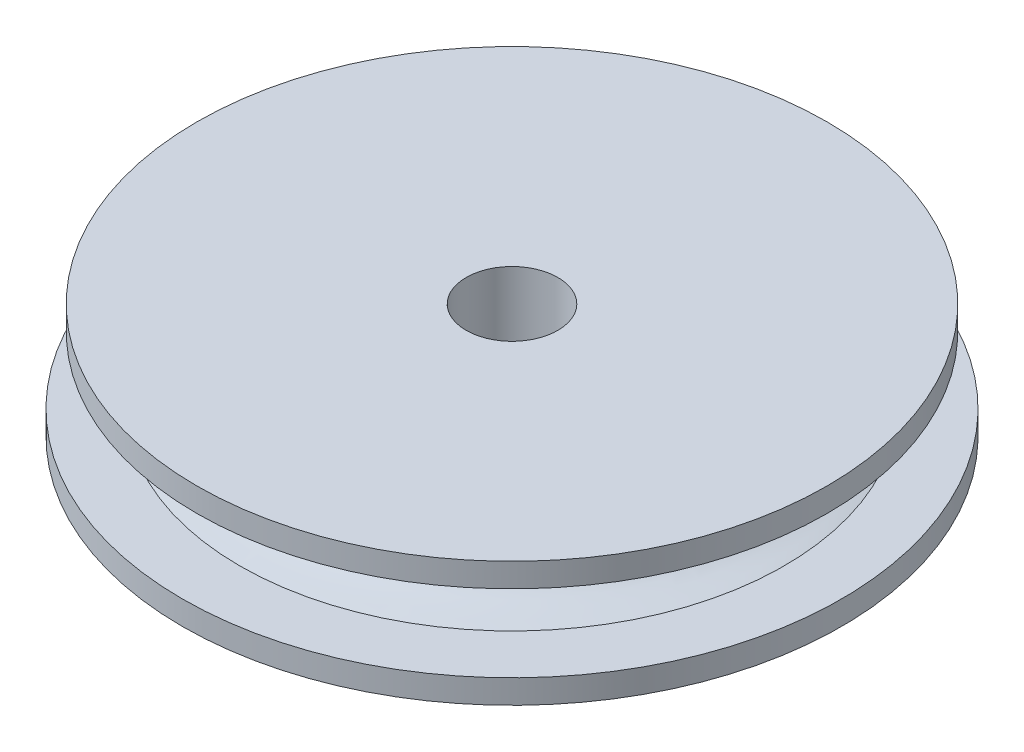
ISO-10303-21;
HEADER;
FILE_DESCRIPTION(('STEP AP214'),'2;1');
FILE_NAME('part.step','',(''),(''),'','','');
FILE_SCHEMA(('AUTOMOTIVE_DESIGN { 1 0 10303 214 1 1 1 1 }'));
ENDSEC;
DATA;
#1=APPLICATION_CONTEXT('core data for automotive mechanical design processes');
#2=APPLICATION_PROTOCOL_DEFINITION('international standard','automotive_design',2000,#1);
#3=PRODUCT_CONTEXT('',#1,'mechanical');
#4=PRODUCT('Part','Part','',(#3));
#5=PRODUCT_RELATED_PRODUCT_CATEGORY('part','',(#4));
#6=PRODUCT_DEFINITION_FORMATION('','',#4);
#7=PRODUCT_DEFINITION_CONTEXT('part definition',#1,'design');
#8=PRODUCT_DEFINITION('design','',#6,#7);
#9=PRODUCT_DEFINITION_SHAPE('','',#8);
#10=(LENGTH_UNIT() NAMED_UNIT(*) SI_UNIT(.MILLI.,.METRE.));
#11=(NAMED_UNIT(*) PLANE_ANGLE_UNIT() SI_UNIT($,.RADIAN.));
#12=(NAMED_UNIT(*) SI_UNIT($,.STERADIAN.) SOLID_ANGLE_UNIT());
#13=UNCERTAINTY_MEASURE_WITH_UNIT(LENGTH_MEASURE(1.E-05),#10,'distance_accuracy_value','');
#14=(GEOMETRIC_REPRESENTATION_CONTEXT(3) GLOBAL_UNCERTAINTY_ASSIGNED_CONTEXT((#13)) GLOBAL_UNIT_ASSIGNED_CONTEXT((#10,
#11,#12)) REPRESENTATION_CONTEXT('',''));
#15=CARTESIAN_POINT('',(0.,0.,0.));
#16=DIRECTION('',(0.,0.,1.));
#17=DIRECTION('',(1.,0.,0.));
#18=AXIS2_PLACEMENT_3D('',#15,#16,#17);
#19=CARTESIAN_POINT('',(0.,0.,0.));
#20=DIRECTION('',(0.,1.,0.));
#21=DIRECTION('',(0.,0.,1.));
#22=AXIS2_PLACEMENT_3D('',#19,#20,#21);
#23=PLANE('',#22);
#24=CARTESIAN_POINT('',(0.,0.,0.));
#25=DIRECTION('',(0.,1.,0.));
#26=DIRECTION('',(0.,0.,1.));
#27=AXIS2_PLACEMENT_3D('',#24,#25,#26);
#28=CIRCLE('',#27,1.6);
#29=CARTESIAN_POINT('',(0.,0.,1.6));
#30=VERTEX_POINT('',#29);
#31=EDGE_CURVE('E49',#30,#30,#28,.T.);
#32=ORIENTED_EDGE('',*,*,#31,.T.);
#33=EDGE_LOOP('',(#32));
#34=FACE_BOUND('',#33,.T.);
#35=CARTESIAN_POINT('',(0.,0.,0.));
#36=DIRECTION('',(0.,-1.,0.));
#37=DIRECTION('',(0.,0.,-1.));
#38=AXIS2_PLACEMENT_3D('',#35,#36,#37);
#39=CIRCLE('',#38,11.5);
#40=CARTESIAN_POINT('',(0.,0.,-11.5));
#41=VERTEX_POINT('',#40);
#42=EDGE_CURVE('E96',#41,#41,#39,.T.);
#43=ORIENTED_EDGE('',*,*,#42,.T.);
#44=EDGE_LOOP('',(#43));
#45=FACE_BOUND('',#44,.T.);
#46=ADVANCED_FACE('F37',(#34,#45),#23,.F.);
#47=CARTESIAN_POINT('',(-9.5,0.832825218891827,0.));
#48=CARTESIAN_POINT('',(-8.91100392274585,1.01519245042772,0.));
#49=CARTESIAN_POINT('',(-7.9401814519897,1.15692306977285,0.));
#50=CARTESIAN_POINT('',(-8.,2.,0.));
#51=B_SPLINE_CURVE_WITH_KNOTS('',3,(#47,#48,#49,#50),.UNSPECIFIED.,.F.,.F.,(4,4),(0.,1.),.UNSPECIFIED.);
#52=CARTESIAN_POINT('',(0.,4.2,0.));
#53=DIRECTION('',(0.,1.,0.));
#54=AXIS1_PLACEMENT('',#52,#53);
#55=SURFACE_OF_REVOLUTION('',#51,#54);
#56=CARTESIAN_POINT('',(0.,2.,0.));
#57=DIRECTION('',(0.,1.,0.));
#58=DIRECTION('',(0.,0.,1.));
#59=AXIS2_PLACEMENT_3D('',#56,#57,#58);
#60=CIRCLE('',#59,8.);
#61=CARTESIAN_POINT('',(0.,2.,8.));
#62=VERTEX_POINT('',#61);
#63=EDGE_CURVE('E10',#62,#62,#60,.T.);
#64=ORIENTED_EDGE('',*,*,#63,.F.);
#65=EDGE_LOOP('',(#64));
#66=FACE_BOUND('',#65,.T.);
#67=CARTESIAN_POINT('',(0.,0.832825218891827,0.));
#68=DIRECTION('',(0.,1.,0.));
#69=DIRECTION('',(0.,0.,1.));
#70=AXIS2_PLACEMENT_3D('',#67,#68,#69);
#71=CIRCLE('',#70,9.5);
#72=CARTESIAN_POINT('',(0.,0.832825218891827,9.5));
#73=VERTEX_POINT('',#72);
#74=EDGE_CURVE('E103',#73,#73,#71,.F.);
#75=ORIENTED_EDGE('',*,*,#74,.F.);
#76=EDGE_LOOP('',(#75));
#77=FACE_BOUND('',#76,.T.);
#78=ADVANCED_FACE('F74',(#66,#77),#55,.T.);
#79=CARTESIAN_POINT('',(-9.5,3.16717478110817,0.));
#80=CARTESIAN_POINT('',(-8.91100392274585,2.98480754957228,0.));
#81=CARTESIAN_POINT('',(-7.9401814519897,2.84307693022715,0.));
#82=CARTESIAN_POINT('',(-8.,2.,0.));
#83=B_SPLINE_CURVE_WITH_KNOTS('',3,(#79,#80,#81,#82),.UNSPECIFIED.,.F.,.F.,(4,4),(0.,1.),.UNSPECIFIED.);
#84=CARTESIAN_POINT('',(0.,4.2,0.));
#85=DIRECTION('',(0.,1.,0.));
#86=AXIS1_PLACEMENT('',#84,#85);
#87=SURFACE_OF_REVOLUTION('',#83,#86);
#88=ORIENTED_EDGE('',*,*,#63,.T.);
#89=EDGE_LOOP('',(#88));
#90=FACE_BOUND('',#89,.T.);
#91=CARTESIAN_POINT('',(0.,3.16717478110817,0.));
#92=DIRECTION('',(0.,1.,0.));
#93=DIRECTION('',(0.,0.,1.));
#94=AXIS2_PLACEMENT_3D('',#91,#92,#93);
#95=CIRCLE('',#94,9.5);
#96=CARTESIAN_POINT('',(0.,3.16717478110817,9.5));
#97=VERTEX_POINT('',#96);
#98=EDGE_CURVE('E44',#97,#97,#95,.T.);
#99=ORIENTED_EDGE('',*,*,#98,.F.);
#100=EDGE_LOOP('',(#99));
#101=FACE_BOUND('',#100,.T.);
#102=ADVANCED_FACE('F69',(#90,#101),#87,.F.);
#103=CARTESIAN_POINT('',(0.,4.,0.));
#104=DIRECTION('',(0.,1.,0.));
#105=DIRECTION('',(0.,0.,1.));
#106=AXIS2_PLACEMENT_3D('',#103,#104,#105);
#107=PLANE('',#106);
#108=CARTESIAN_POINT('',(0.,4.,0.));
#109=DIRECTION('',(0.,1.,0.));
#110=DIRECTION('',(0.,0.,1.));
#111=AXIS2_PLACEMENT_3D('',#108,#109,#110);
#112=CIRCLE('',#111,1.6);
#113=CARTESIAN_POINT('',(0.,4.,1.6));
#114=VERTEX_POINT('',#113);
#115=EDGE_CURVE('E54',#114,#114,#112,.T.);
#116=ORIENTED_EDGE('',*,*,#115,.F.);
#117=EDGE_LOOP('',(#116));
#118=FACE_BOUND('',#117,.T.);
#119=CARTESIAN_POINT('',(0.,4.,0.));
#120=DIRECTION('',(0.,1.,0.));
#121=DIRECTION('',(0.,0.,1.));
#122=AXIS2_PLACEMENT_3D('',#119,#120,#121);
#123=CIRCLE('',#122,11.);
#124=CARTESIAN_POINT('',(0.,4.,11.));
#125=VERTEX_POINT('',#124);
#126=EDGE_CURVE('E109',#125,#125,#123,.T.);
#127=ORIENTED_EDGE('',*,*,#126,.T.);
#128=EDGE_LOOP('',(#127));
#129=FACE_BOUND('',#128,.T.);
#130=ADVANCED_FACE('F73',(#118,#129),#107,.T.);
#131=CARTESIAN_POINT('',(0.,0.,0.));
#132=DIRECTION('',(0.,1.,0.));
#133=DIRECTION('',(0.,0.,1.));
#134=AXIS2_PLACEMENT_3D('',#131,#132,#133);
#135=CYLINDRICAL_SURFACE('',#134,1.6);
#136=ORIENTED_EDGE('',*,*,#31,.F.);
#137=EDGE_LOOP('',(#136));
#138=FACE_BOUND('',#137,.T.);
#139=ORIENTED_EDGE('',*,*,#115,.T.);
#140=EDGE_LOOP('',(#139));
#141=FACE_BOUND('',#140,.T.);
#142=ADVANCED_FACE('F75',(#138,#141),#135,.F.);
#143=CARTESIAN_POINT('',(0.,3.16717478110817,0.));
#144=DIRECTION('',(0.,1.,0.));
#145=DIRECTION('',(0.,0.,1.));
#146=AXIS2_PLACEMENT_3D('',#143,#144,#145);
#147=PLANE('',#146);
#148=CARTESIAN_POINT('',(0.,3.16717478110817,0.));
#149=DIRECTION('',(0.,1.,0.));
#150=DIRECTION('',(0.,0.,1.));
#151=AXIS2_PLACEMENT_3D('',#148,#149,#150);
#152=CIRCLE('',#151,11.);
#153=CARTESIAN_POINT('',(0.,3.16717478110817,11.));
#154=VERTEX_POINT('',#153);
#155=EDGE_CURVE('E110',#154,#154,#152,.T.);
#156=ORIENTED_EDGE('',*,*,#155,.F.);
#157=EDGE_LOOP('',(#156));
#158=FACE_BOUND('',#157,.T.);
#159=ORIENTED_EDGE('',*,*,#98,.T.);
#160=EDGE_LOOP('',(#159));
#161=FACE_BOUND('',#160,.T.);
#162=ADVANCED_FACE('F84',(#158,#161),#147,.F.);
#163=CARTESIAN_POINT('',(0.,3.16717478110817,0.));
#164=DIRECTION('',(0.,1.,0.));
#165=DIRECTION('',(0.,0.,1.));
#166=AXIS2_PLACEMENT_3D('',#163,#164,#165);
#167=CYLINDRICAL_SURFACE('',#166,11.);
#168=CARTESIAN_POINT('',(0.,3.16717478110817,11.));
#169=CARTESIAN_POINT('',(0.,3.17585004380496,11.));
#170=CARTESIAN_POINT('',(0.,3.18452530650175,11.));
#171=CARTESIAN_POINT('',(0.,3.20187583189533,11.));
#172=CARTESIAN_POINT('',(0.,3.21055109459212,11.));
#173=CARTESIAN_POINT('',(0.,3.2279016199857,11.));
#174=CARTESIAN_POINT('',(0.,3.23657688268249,11.));
#175=CARTESIAN_POINT('',(0.,3.25392740807607,11.));
#176=CARTESIAN_POINT('',(0.,3.26260267077286,11.));
#177=CARTESIAN_POINT('',(0.,3.27995319616644,11.));
#178=CARTESIAN_POINT('',(0.,3.28862845886323,11.));
#179=CARTESIAN_POINT('',(0.,3.30597898425681,11.));
#180=CARTESIAN_POINT('',(0.,3.3146542469536,11.));
#181=CARTESIAN_POINT('',(0.,3.33200477234718,11.));
#182=CARTESIAN_POINT('',(0.,3.34068003504397,11.));
#183=CARTESIAN_POINT('',(0.,3.35803056043755,11.));
#184=CARTESIAN_POINT('',(0.,3.36670582313434,11.));
#185=CARTESIAN_POINT('',(0.,3.38405634852792,11.));
#186=CARTESIAN_POINT('',(0.,3.39273161122471,11.));
#187=CARTESIAN_POINT('',(0.,3.41008213661829,11.));
#188=CARTESIAN_POINT('',(0.,3.41875739931508,11.));
#189=CARTESIAN_POINT('',(0.,3.43610792470866,11.));
#190=CARTESIAN_POINT('',(0.,3.44478318740545,11.));
#191=CARTESIAN_POINT('',(0.,3.46213371279903,11.));
#192=CARTESIAN_POINT('',(0.,3.47080897549582,11.));
#193=CARTESIAN_POINT('',(0.,3.4881595008894,11.));
#194=CARTESIAN_POINT('',(0.,3.49683476358619,11.));
#195=CARTESIAN_POINT('',(0.,3.51418528897977,11.));
#196=CARTESIAN_POINT('',(0.,3.52286055167656,11.));
#197=CARTESIAN_POINT('',(0.,3.54021107707014,11.));
#198=CARTESIAN_POINT('',(0.,3.54888633976693,11.));
#199=CARTESIAN_POINT('',(0.,3.56623686516051,11.));
#200=CARTESIAN_POINT('',(0.,3.5749121278573,11.));
#201=CARTESIAN_POINT('',(0.,3.59226265325088,11.));
#202=CARTESIAN_POINT('',(0.,3.60093791594767,11.));
#203=CARTESIAN_POINT('',(0.,3.61828844134125,11.));
#204=CARTESIAN_POINT('',(0.,3.62696370403804,11.));
#205=CARTESIAN_POINT('',(0.,3.64431422943162,11.));
#206=CARTESIAN_POINT('',(0.,3.6529894921284,11.));
#207=CARTESIAN_POINT('',(0.,3.67034001752198,11.));
#208=CARTESIAN_POINT('',(0.,3.67901528021877,11.));
#209=CARTESIAN_POINT('',(0.,3.69636580561235,11.));
#210=CARTESIAN_POINT('',(0.,3.70504106830914,11.));
#211=CARTESIAN_POINT('',(0.,3.72239159370272,11.));
#212=CARTESIAN_POINT('',(0.,3.73106685639951,11.));
#213=CARTESIAN_POINT('',(0.,3.74841738179309,11.));
#214=CARTESIAN_POINT('',(0.,3.75709264448988,11.));
#215=CARTESIAN_POINT('',(0.,3.77444316988346,11.));
#216=CARTESIAN_POINT('',(0.,3.78311843258025,11.));
#217=CARTESIAN_POINT('',(0.,3.80046895797383,11.));
#218=CARTESIAN_POINT('',(0.,3.80914422067062,11.));
#219=CARTESIAN_POINT('',(0.,3.8264947460642,11.));
#220=CARTESIAN_POINT('',(0.,3.83517000876099,11.));
#221=CARTESIAN_POINT('',(0.,3.85252053415457,11.));
#222=CARTESIAN_POINT('',(0.,3.86119579685136,11.));
#223=CARTESIAN_POINT('',(0.,3.87854632224494,11.));
#224=CARTESIAN_POINT('',(0.,3.88722158494173,11.));
#225=CARTESIAN_POINT('',(0.,3.90457211033531,11.));
#226=CARTESIAN_POINT('',(0.,3.9132473730321,11.));
#227=CARTESIAN_POINT('',(0.,3.93059789842568,11.));
#228=CARTESIAN_POINT('',(0.,3.93927316112247,11.));
#229=CARTESIAN_POINT('',(0.,3.95662368651605,11.));
#230=CARTESIAN_POINT('',(0.,3.96529894921284,11.));
#231=CARTESIAN_POINT('',(0.,3.98264947460642,11.));
#232=CARTESIAN_POINT('',(0.,3.99132473730321,11.));
#233=CARTESIAN_POINT('',(0.,4.,11.));
#234=B_SPLINE_CURVE_WITH_KNOTS('',3,(#168,#169,#170,#171,#172,#173,#174,#175,#176,#177,#178,
#179,#180,#181,#182,#183,#184,#185,#186,#187,#188,#189,#190,#191,#192,#193,#194,#195,#196,#197,
#198,#199,#200,#201,#202,#203,#204,#205,#206,#207,#208,#209,#210,#211,#212,#213,#214,#215,#216,
#217,#218,#219,#220,#221,#222,#223,#224,#225,#226,#227,#228,#229,#230,#231,#232,#233),
.UNSPECIFIED.,.F.,.F.,(4,2,2,2,2,2,2,2,2,2,2,2,2,2,2,2,2,2,2,2,2,2,2,2,2,2,2,2,2,2,2,2,4),(0.,
0.0260257880903697,0.0520515761807394,0.0780773642711091,0.104103152361478,0.130128940451848,
0.156154728542218,0.182180516632587,0.208206304722957,0.234232092813326,0.260257880903696,
0.286283668994065,0.312309457084435,0.338335245174805,0.364361033265175,0.390386821355544,
0.416412609445914,0.442438397536283,0.468464185626653,0.494489973717022,0.520515761807392,
0.546541549897762,0.572567337988131,0.598593126078501,0.62461891416887,0.65064470225924,
0.676670490349609,0.702696278439979,0.728722066530349,0.754747854620718,0.780773642711088,
0.806799430801458,0.832825218891827),.UNSPECIFIED.);
#235=EDGE_CURVE('BSEAM121',#154,#125,#234,.T.);
#236=ORIENTED_EDGE('',*,*,#155,.T.);
#237=ORIENTED_EDGE('',*,*,#126,.F.);
#238=ORIENTED_EDGE('',*,*,#235,.T.);
#239=ORIENTED_EDGE('',*,*,#235,.F.);
#240=EDGE_LOOP('',(#236,#238,#237,#239));
#241=FACE_BOUND('',#240,.T.);
#242=ADVANCED_FACE('F121',(#241),#167,.T.);
#243=CARTESIAN_POINT('',(0.,0.832825218891827,0.));
#244=DIRECTION('',(0.,-1.,0.));
#245=DIRECTION('',(0.,0.,-1.));
#246=AXIS2_PLACEMENT_3D('',#243,#244,#245);
#247=PLANE('',#246);
#248=CARTESIAN_POINT('',(0.,0.832825218891827,0.));
#249=DIRECTION('',(0.,-1.,0.));
#250=DIRECTION('',(0.,0.,-1.));
#251=AXIS2_PLACEMENT_3D('',#248,#249,#250);
#252=CIRCLE('',#251,11.5);
#253=CARTESIAN_POINT('',(0.,0.832825218891827,-11.5));
#254=VERTEX_POINT('',#253);
#255=EDGE_CURVE('E99',#254,#254,#252,.T.);
#256=ORIENTED_EDGE('',*,*,#255,.F.);
#257=EDGE_LOOP('',(#256));
#258=FACE_BOUND('',#257,.T.);
#259=ORIENTED_EDGE('',*,*,#74,.T.);
#260=EDGE_LOOP('',(#259));
#261=FACE_BOUND('',#260,.T.);
#262=ADVANCED_FACE('F123',(#258,#261),#247,.F.);
#263=CARTESIAN_POINT('',(0.,0.832825218891827,0.));
#264=DIRECTION('',(0.,-1.,0.));
#265=DIRECTION('',(0.,0.,-1.));
#266=AXIS2_PLACEMENT_3D('',#263,#264,#265);
#267=CYLINDRICAL_SURFACE('',#266,11.5);
#268=CARTESIAN_POINT('',(0.,0.832825218891827,-11.5));
#269=CARTESIAN_POINT('',(0.,0.824149956195037,-11.5));
#270=CARTESIAN_POINT('',(0.,0.815474693498248,-11.5));
#271=CARTESIAN_POINT('',(0.,0.798124168104668,-11.5));
#272=CARTESIAN_POINT('',(0.,0.789448905407878,-11.5));
#273=CARTESIAN_POINT('',(0.,0.772098380014298,-11.5));
#274=CARTESIAN_POINT('',(0.,0.763423117317508,-11.5));
#275=CARTESIAN_POINT('',(0.,0.746072591923929,-11.5));
#276=CARTESIAN_POINT('',(0.,0.737397329227139,-11.5));
#277=CARTESIAN_POINT('',(0.,0.720046803833559,-11.5));
#278=CARTESIAN_POINT('',(0.,0.711371541136769,-11.5));
#279=CARTESIAN_POINT('',(0.,0.694021015743189,-11.5));
#280=CARTESIAN_POINT('',(0.,0.685345753046399,-11.5));
#281=CARTESIAN_POINT('',(0.,0.66799522765282,-11.5));
#282=CARTESIAN_POINT('',(0.,0.65931996495603,-11.5));
#283=CARTESIAN_POINT('',(0.,0.64196943956245,-11.5));
#284=CARTESIAN_POINT('',(0.,0.63329417686566,-11.5));
#285=CARTESIAN_POINT('',(0.,0.615943651472081,-11.5));
#286=CARTESIAN_POINT('',(0.,0.607268388775291,-11.5));
#287=CARTESIAN_POINT('',(0.,0.589917863381711,-11.5));
#288=CARTESIAN_POINT('',(0.,0.581242600684921,-11.5));
#289=CARTESIAN_POINT('',(0.,0.563892075291341,-11.5));
#290=CARTESIAN_POINT('',(0.,0.555216812594551,-11.5));
#291=CARTESIAN_POINT('',(0.,0.537866287200972,-11.5));
#292=CARTESIAN_POINT('',(0.,0.529191024504182,-11.5));
#293=CARTESIAN_POINT('',(0.,0.511840499110602,-11.5));
#294=CARTESIAN_POINT('',(0.,0.503165236413812,-11.5));
#295=CARTESIAN_POINT('',(0.,0.485814711020233,-11.5));
#296=CARTESIAN_POINT('',(0.,0.477139448323443,-11.5));
#297=CARTESIAN_POINT('',(0.,0.459788922929863,-11.5));
#298=CARTESIAN_POINT('',(0.,0.451113660233073,-11.5));
#299=CARTESIAN_POINT('',(0.,0.433763134839493,-11.5));
#300=CARTESIAN_POINT('',(0.,0.425087872142703,-11.5));
#301=CARTESIAN_POINT('',(0.,0.407737346749124,-11.5));
#302=CARTESIAN_POINT('',(0.,0.399062084052334,-11.5));
#303=CARTESIAN_POINT('',(0.,0.381711558658754,-11.5));
#304=CARTESIAN_POINT('',(0.,0.373036295961964,-11.5));
#305=CARTESIAN_POINT('',(0.,0.355685770568385,-11.5));
#306=CARTESIAN_POINT('',(0.,0.347010507871595,-11.5));
#307=CARTESIAN_POINT('',(0.,0.329659982478015,-11.5));
#308=CARTESIAN_POINT('',(0.,0.320984719781225,-11.5));
#309=CARTESIAN_POINT('',(0.,0.303634194387645,-11.5));
#310=CARTESIAN_POINT('',(0.,0.294958931690856,-11.5));
#311=CARTESIAN_POINT('',(0.,0.277608406297276,-11.5));
#312=CARTESIAN_POINT('',(0.,0.268933143600486,-11.5));
#313=CARTESIAN_POINT('',(0.,0.251582618206906,-11.5));
#314=CARTESIAN_POINT('',(0.,0.242907355510116,-11.5));
#315=CARTESIAN_POINT('',(0.,0.225556830116537,-11.5));
#316=CARTESIAN_POINT('',(0.,0.216881567419747,-11.5));
#317=CARTESIAN_POINT('',(0.,0.199531042026167,-11.5));
#318=CARTESIAN_POINT('',(0.,0.190855779329377,-11.5));
#319=CARTESIAN_POINT('',(0.,0.173505253935797,-11.5));
#320=CARTESIAN_POINT('',(0.,0.164829991239008,-11.5));
#321=CARTESIAN_POINT('',(0.,0.147479465845428,-11.5));
#322=CARTESIAN_POINT('',(0.,0.138804203148638,-11.5));
#323=CARTESIAN_POINT('',(0.,0.121453677755058,-11.5));
#324=CARTESIAN_POINT('',(0.,0.112778415058268,-11.5));
#325=CARTESIAN_POINT('',(0.,0.0954278896646886,-11.5));
#326=CARTESIAN_POINT('',(0.,0.0867526269678988,-11.5));
#327=CARTESIAN_POINT('',(0.,0.069402101574319,-11.5));
#328=CARTESIAN_POINT('',(0.,0.0607268388775292,-11.5));
#329=CARTESIAN_POINT('',(0.,0.0433763134839494,-11.5));
#330=CARTESIAN_POINT('',(0.,0.0347010507871596,-11.5));
#331=CARTESIAN_POINT('',(0.,0.0173505253935798,-11.5));
#332=CARTESIAN_POINT('',(0.,0.00867526269678997,-11.5));
#333=CARTESIAN_POINT('',(0.,0.,-11.5));
#334=B_SPLINE_CURVE_WITH_KNOTS('',3,(#268,#269,#270,#271,#272,#273,#274,#275,#276,#277,#278,
#279,#280,#281,#282,#283,#284,#285,#286,#287,#288,#289,#290,#291,#292,#293,#294,#295,#296,#297,
#298,#299,#300,#301,#302,#303,#304,#305,#306,#307,#308,#309,#310,#311,#312,#313,#314,#315,#316,
#317,#318,#319,#320,#321,#322,#323,#324,#325,#326,#327,#328,#329,#330,#331,#332,#333),
.UNSPECIFIED.,.F.,.F.,(4,2,2,2,2,2,2,2,2,2,2,2,2,2,2,2,2,2,2,2,2,2,2,2,2,2,2,2,2,2,2,2,4),(0.,
0.0260257880903696,0.0520515761807393,0.0780773642711088,0.104103152361479,0.130128940451848,
0.156154728542218,0.182180516632587,0.208206304722957,0.234232092813326,0.260257880903696,
0.286283668994066,0.312309457084435,0.338335245174805,0.364361033265174,0.390386821355544,
0.416412609445914,0.442438397536283,0.468464185626653,0.494489973717022,0.520515761807392,
0.546541549897761,0.572567337988131,0.598593126078501,0.62461891416887,0.65064470225924,
0.67667049034961,0.702696278439979,0.728722066530349,0.754747854620718,0.780773642711088,
0.806799430801458,0.832825218891827),.UNSPECIFIED.);
#335=EDGE_CURVE('BSEAM129',#254,#41,#334,.T.);
#336=ORIENTED_EDGE('',*,*,#255,.T.);
#337=ORIENTED_EDGE('',*,*,#42,.F.);
#338=ORIENTED_EDGE('',*,*,#335,.T.);
#339=ORIENTED_EDGE('',*,*,#335,.F.);
#340=EDGE_LOOP('',(#336,#338,#337,#339));
#341=FACE_BOUND('',#340,.T.);
#342=ADVANCED_FACE('F129',(#341),#267,.T.);
#343=CLOSED_SHELL('',(#46,#78,#102,#130,#142,#162,#242,#262,#342));
#344=MANIFOLD_SOLID_BREP('B2',#343);
#345=ADVANCED_BREP_SHAPE_REPRESENTATION('',(#18,#344),#14);
#346=SHAPE_DEFINITION_REPRESENTATION(#9,#345);
ENDSEC;
END-ISO-10303-21;
